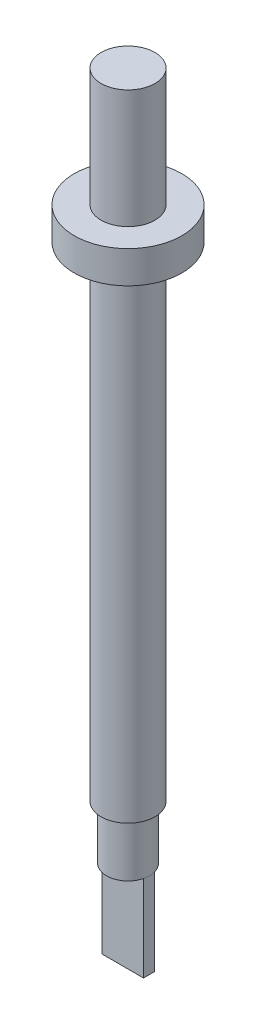
ISO-10303-21;
HEADER;
FILE_DESCRIPTION(('STEP AP214'),'2;1');
FILE_NAME('part.step','',(''),(''),'','','');
FILE_SCHEMA(('AUTOMOTIVE_DESIGN { 1 0 10303 214 1 1 1 1 }'));
ENDSEC;
DATA;
#1=APPLICATION_CONTEXT('core data for automotive mechanical design processes');
#2=APPLICATION_PROTOCOL_DEFINITION('international standard','automotive_design',2000,#1);
#3=PRODUCT_CONTEXT('',#1,'mechanical');
#4=PRODUCT('Part','Part','',(#3));
#5=PRODUCT_RELATED_PRODUCT_CATEGORY('part','',(#4));
#6=PRODUCT_DEFINITION_FORMATION('','',#4);
#7=PRODUCT_DEFINITION_CONTEXT('part definition',#1,'design');
#8=PRODUCT_DEFINITION('design','',#6,#7);
#9=PRODUCT_DEFINITION_SHAPE('','',#8);
#10=(LENGTH_UNIT() NAMED_UNIT(*) SI_UNIT(.MILLI.,.METRE.));
#11=(NAMED_UNIT(*) PLANE_ANGLE_UNIT() SI_UNIT($,.RADIAN.));
#12=(NAMED_UNIT(*) SI_UNIT($,.STERADIAN.) SOLID_ANGLE_UNIT());
#13=UNCERTAINTY_MEASURE_WITH_UNIT(LENGTH_MEASURE(1.E-05),#10,'distance_accuracy_value','');
#14=(GEOMETRIC_REPRESENTATION_CONTEXT(3) GLOBAL_UNCERTAINTY_ASSIGNED_CONTEXT((#13)) GLOBAL_UNIT_ASSIGNED_CONTEXT((#10,
#11,#12)) REPRESENTATION_CONTEXT('',''));
#15=CARTESIAN_POINT('',(0.,0.,0.));
#16=DIRECTION('',(0.,0.,1.));
#17=DIRECTION('',(1.,0.,0.));
#18=AXIS2_PLACEMENT_3D('',#15,#16,#17);
#19=CARTESIAN_POINT('',(0.,0.,0.));
#20=DIRECTION('',(0.,-1.,0.));
#21=DIRECTION('',(0.,0.,-1.));
#22=AXIS2_PLACEMENT_3D('',#19,#20,#21);
#23=PLANE('',#22);
#24=DIRECTION('',(0.,0.,-1.));
#25=VECTOR('',#24,1.);
#26=CARTESIAN_POINT('',(-1.93649167310371,0.,0.5));
#27=LINE('',#26,#25);
#28=CARTESIAN_POINT('',(-1.93649167310371,0.,0.5));
#29=VERTEX_POINT('',#28);
#30=CARTESIAN_POINT('',(-1.93649167310371,0.,-0.5));
#31=VERTEX_POINT('',#30);
#32=EDGE_CURVE('E62',#29,#31,#27,.T.);
#33=ORIENTED_EDGE('',*,*,#32,.F.);
#34=CARTESIAN_POINT('',(0.,0.,0.));
#35=DIRECTION('',(0.,-1.,0.));
#36=DIRECTION('',(0.,0.,-1.));
#37=AXIS2_PLACEMENT_3D('',#34,#35,#36);
#38=CIRCLE('',#37,2.);
#39=EDGE_CURVE('E127',#29,#31,#38,.T.);
#40=ORIENTED_EDGE('',*,*,#39,.T.);
#41=EDGE_LOOP('',(#33,#40));
#42=FACE_BOUND('',#41,.T.);
#43=ADVANCED_FACE('F39',(#42),#23,.T.);
#44=DIRECTION('',(-1.,0.,0.));
#45=VECTOR('',#44,1.);
#46=CARTESIAN_POINT('',(-1.93649167310371,0.,0.5));
#47=LINE('',#46,#45);
#48=CARTESIAN_POINT('',(1.93649167310371,0.,0.499999999999999));
#49=VERTEX_POINT('',#48);
#50=EDGE_CURVE('E105',#49,#29,#47,.T.);
#51=ORIENTED_EDGE('',*,*,#50,.F.);
#52=EDGE_CURVE('E126',#49,#29,#38,.T.);
#53=ORIENTED_EDGE('',*,*,#52,.T.);
#54=EDGE_LOOP('',(#51,#53));
#55=FACE_BOUND('',#54,.T.);
#56=ADVANCED_FACE('F138',(#55),#23,.T.);
#57=DIRECTION('',(0.,0.,1.));
#58=VECTOR('',#57,1.);
#59=CARTESIAN_POINT('',(1.93649167310371,0.,0.5));
#60=LINE('',#59,#58);
#61=CARTESIAN_POINT('',(1.93649167310371,0.,-0.5));
#62=VERTEX_POINT('',#61);
#63=EDGE_CURVE('E141',#62,#49,#60,.T.);
#64=ORIENTED_EDGE('',*,*,#63,.F.);
#65=EDGE_CURVE('E43',#62,#49,#38,.T.);
#66=ORIENTED_EDGE('',*,*,#65,.T.);
#67=EDGE_LOOP('',(#64,#66));
#68=FACE_BOUND('',#67,.T.);
#69=ADVANCED_FACE('F199',(#68),#23,.T.);
#70=DIRECTION('',(1.,0.,0.));
#71=VECTOR('',#70,1.);
#72=CARTESIAN_POINT('',(-1.93649167310371,0.,-0.5));
#73=LINE('',#72,#71);
#74=EDGE_CURVE('E53',#31,#62,#73,.T.);
#75=ORIENTED_EDGE('',*,*,#74,.F.);
#76=EDGE_CURVE('E122',#31,#62,#38,.T.);
#77=ORIENTED_EDGE('',*,*,#76,.T.);
#78=EDGE_LOOP('',(#75,#77));
#79=FACE_BOUND('',#78,.T.);
#80=ADVANCED_FACE('F41',(#79),#23,.T.);
#81=CARTESIAN_POINT('',(0.,0.,0.));
#82=DIRECTION('',(0.,-1.,0.));
#83=DIRECTION('',(0.,0.,-1.));
#84=AXIS2_PLACEMENT_3D('',#81,#82,#83);
#85=CYLINDRICAL_SURFACE('',#84,2.);
#86=CARTESIAN_POINT('',(0.,5.,0.));
#87=DIRECTION('',(0.,-1.,0.));
#88=DIRECTION('',(0.,0.,-1.));
#89=AXIS2_PLACEMENT_3D('',#86,#87,#88);
#90=CIRCLE('',#89,2.);
#91=CARTESIAN_POINT('',(0.,5.,-2.));
#92=VERTEX_POINT('',#91);
#93=EDGE_CURVE('E123',#92,#92,#90,.T.);
#94=ORIENTED_EDGE('',*,*,#93,.T.);
#95=EDGE_LOOP('',(#94));
#96=FACE_BOUND('',#95,.T.);
#97=ORIENTED_EDGE('',*,*,#65,.F.);
#98=ORIENTED_EDGE('',*,*,#76,.F.);
#99=ORIENTED_EDGE('',*,*,#39,.F.);
#100=ORIENTED_EDGE('',*,*,#52,.F.);
#101=EDGE_LOOP('',(#97,#98,#99,#100));
#102=FACE_BOUND('',#101,.T.);
#103=ADVANCED_FACE('F193',(#96,#102),#85,.T.);
#104=CARTESIAN_POINT('',(2.,5.,0.));
#105=DIRECTION('',(0.,-1.,0.));
#106=DIRECTION('',(0.,0.,-1.));
#107=AXIS2_PLACEMENT_3D('',#104,#105,#106);
#108=PLANE('',#107);
#109=CARTESIAN_POINT('',(0.,5.,0.));
#110=DIRECTION('',(0.,-1.,0.));
#111=DIRECTION('',(0.,0.,-1.));
#112=AXIS2_PLACEMENT_3D('',#109,#110,#111);
#113=CIRCLE('',#112,2.5);
#114=CARTESIAN_POINT('',(0.,5.,-2.5));
#115=VERTEX_POINT('',#114);
#116=EDGE_CURVE('E116',#115,#115,#113,.T.);
#117=ORIENTED_EDGE('',*,*,#116,.T.);
#118=EDGE_LOOP('',(#117));
#119=FACE_BOUND('',#118,.T.);
#120=ORIENTED_EDGE('',*,*,#93,.F.);
#121=EDGE_LOOP('',(#120));
#122=FACE_BOUND('',#121,.T.);
#123=ADVANCED_FACE('F183',(#119,#122),#108,.T.);
#124=CARTESIAN_POINT('',(0.,0.,0.));
#125=DIRECTION('',(0.,-1.,0.));
#126=DIRECTION('',(0.,0.,-1.));
#127=AXIS2_PLACEMENT_3D('',#124,#125,#126);
#128=CYLINDRICAL_SURFACE('',#127,2.5);
#129=CARTESIAN_POINT('',(0.,50.,0.));
#130=DIRECTION('',(0.,-1.,0.));
#131=DIRECTION('',(0.,0.,-1.));
#132=AXIS2_PLACEMENT_3D('',#129,#130,#131);
#133=CIRCLE('',#132,2.5);
#134=CARTESIAN_POINT('',(0.,50.,-2.5));
#135=VERTEX_POINT('',#134);
#136=EDGE_CURVE('E117',#135,#135,#133,.T.);
#137=ORIENTED_EDGE('',*,*,#136,.T.);
#138=EDGE_LOOP('',(#137));
#139=FACE_BOUND('',#138,.T.);
#140=ORIENTED_EDGE('',*,*,#116,.F.);
#141=EDGE_LOOP('',(#140));
#142=FACE_BOUND('',#141,.T.);
#143=ADVANCED_FACE('F180',(#139,#142),#128,.T.);
#144=CARTESIAN_POINT('',(5.,50.,0.));
#145=DIRECTION('',(0.,-1.,0.));
#146=DIRECTION('',(0.,0.,-1.));
#147=AXIS2_PLACEMENT_3D('',#144,#145,#146);
#148=PLANE('',#147);
#149=CARTESIAN_POINT('',(0.,50.,0.));
#150=DIRECTION('',(0.,-1.,0.));
#151=DIRECTION('',(0.,0.,-1.));
#152=AXIS2_PLACEMENT_3D('',#149,#150,#151);
#153=CIRCLE('',#152,5.);
#154=CARTESIAN_POINT('',(0.,50.,-5.));
#155=VERTEX_POINT('',#154);
#156=EDGE_CURVE('E107',#155,#155,#153,.T.);
#157=ORIENTED_EDGE('',*,*,#156,.T.);
#158=EDGE_LOOP('',(#157));
#159=FACE_BOUND('',#158,.T.);
#160=ORIENTED_EDGE('',*,*,#136,.F.);
#161=EDGE_LOOP('',(#160));
#162=FACE_BOUND('',#161,.T.);
#163=ADVANCED_FACE('F174',(#159,#162),#148,.T.);
#164=CARTESIAN_POINT('',(0.,0.,0.));
#165=DIRECTION('',(0.,-1.,0.));
#166=DIRECTION('',(0.,0.,-1.));
#167=AXIS2_PLACEMENT_3D('',#164,#165,#166);
#168=CYLINDRICAL_SURFACE('',#167,5.);
#169=CARTESIAN_POINT('',(0.,53.,0.));
#170=DIRECTION('',(0.,-1.,0.));
#171=DIRECTION('',(0.,0.,-1.));
#172=AXIS2_PLACEMENT_3D('',#169,#170,#171);
#173=CIRCLE('',#172,5.);
#174=CARTESIAN_POINT('',(0.,53.,-5.));
#175=VERTEX_POINT('',#174);
#176=EDGE_CURVE('E104',#175,#175,#173,.T.);
#177=ORIENTED_EDGE('',*,*,#176,.T.);
#178=EDGE_LOOP('',(#177));
#179=FACE_BOUND('',#178,.T.);
#180=ORIENTED_EDGE('',*,*,#156,.F.);
#181=EDGE_LOOP('',(#180));
#182=FACE_BOUND('',#181,.T.);
#183=ADVANCED_FACE('F170',(#179,#182),#168,.T.);
#184=CARTESIAN_POINT('',(0.,53.,0.));
#185=DIRECTION('',(0.,1.,0.));
#186=DIRECTION('',(0.,0.,1.));
#187=AXIS2_PLACEMENT_3D('',#184,#185,#186);
#188=PLANE('',#187);
#189=CARTESIAN_POINT('',(0.,53.,0.));
#190=DIRECTION('',(0.,1.,0.));
#191=DIRECTION('',(0.,0.,1.));
#192=AXIS2_PLACEMENT_3D('',#189,#190,#191);
#193=CIRCLE('',#192,2.5);
#194=CARTESIAN_POINT('',(0.,53.,2.5));
#195=VERTEX_POINT('',#194);
#196=EDGE_CURVE('E11',#195,#195,#193,.T.);
#197=ORIENTED_EDGE('',*,*,#196,.F.);
#198=EDGE_LOOP('',(#197));
#199=FACE_BOUND('',#198,.T.);
#200=ORIENTED_EDGE('',*,*,#176,.F.);
#201=EDGE_LOOP('',(#200));
#202=FACE_BOUND('',#201,.T.);
#203=ADVANCED_FACE('F163',(#199,#202),#188,.T.);
#204=CARTESIAN_POINT('',(-1.93649167310371,-8.,0.5));
#205=DIRECTION('',(1.,0.,0.));
#206=DIRECTION('',(0.,0.,-1.));
#207=AXIS2_PLACEMENT_3D('',#204,#205,#206);
#208=PLANE('',#207);
#209=ORIENTED_EDGE('',*,*,#32,.T.);
#210=DIRECTION('',(0.,1.,0.));
#211=VECTOR('',#210,1.);
#212=CARTESIAN_POINT('',(-1.93649167310371,-8.,-0.5));
#213=LINE('',#212,#211);
#214=CARTESIAN_POINT('',(-1.93649167310371,-8.,-0.5));
#215=VERTEX_POINT('',#214);
#216=EDGE_CURVE('E87',#215,#31,#213,.T.);
#217=ORIENTED_EDGE('',*,*,#216,.F.);
#218=DIRECTION('',(0.,0.,-1.));
#219=VECTOR('',#218,1.);
#220=CARTESIAN_POINT('',(-1.93649167310371,-8.,0.5));
#221=LINE('',#220,#219);
#222=CARTESIAN_POINT('',(-1.93649167310371,-8.,0.5));
#223=VERTEX_POINT('',#222);
#224=EDGE_CURVE('E91',#223,#215,#221,.T.);
#225=ORIENTED_EDGE('',*,*,#224,.F.);
#226=DIRECTION('',(0.,1.,0.));
#227=VECTOR('',#226,1.);
#228=CARTESIAN_POINT('',(-1.93649167310371,-8.,0.5));
#229=LINE('',#228,#227);
#230=EDGE_CURVE('E143',#223,#29,#229,.T.);
#231=ORIENTED_EDGE('',*,*,#230,.T.);
#232=EDGE_LOOP('',(#209,#217,#225,#231));
#233=FACE_BOUND('',#232,.T.);
#234=ADVANCED_FACE('F102',(#233),#208,.F.);
#235=CARTESIAN_POINT('',(-1.93649167310371,-8.,-0.5));
#236=DIRECTION('',(0.,0.,1.));
#237=DIRECTION('',(1.,0.,0.));
#238=AXIS2_PLACEMENT_3D('',#235,#236,#237);
#239=PLANE('',#238);
#240=ORIENTED_EDGE('',*,*,#74,.T.);
#241=DIRECTION('',(0.,1.,0.));
#242=VECTOR('',#241,1.);
#243=CARTESIAN_POINT('',(1.93649167310371,-8.,-0.5));
#244=LINE('',#243,#242);
#245=CARTESIAN_POINT('',(1.93649167310371,-8.,-0.5));
#246=VERTEX_POINT('',#245);
#247=EDGE_CURVE('E90',#246,#62,#244,.T.);
#248=ORIENTED_EDGE('',*,*,#247,.F.);
#249=DIRECTION('',(1.,0.,0.));
#250=VECTOR('',#249,1.);
#251=CARTESIAN_POINT('',(-1.93649167310371,-8.,-0.5));
#252=LINE('',#251,#250);
#253=EDGE_CURVE('E82',#215,#246,#252,.T.);
#254=ORIENTED_EDGE('',*,*,#253,.F.);
#255=ORIENTED_EDGE('',*,*,#216,.T.);
#256=EDGE_LOOP('',(#240,#248,#254,#255));
#257=FACE_BOUND('',#256,.T.);
#258=ADVANCED_FACE('F81',(#257),#239,.F.);
#259=CARTESIAN_POINT('',(1.93649167310371,-8.,0.5));
#260=DIRECTION('',(-1.,0.,0.));
#261=DIRECTION('',(0.,0.,1.));
#262=AXIS2_PLACEMENT_3D('',#259,#260,#261);
#263=PLANE('',#262);
#264=ORIENTED_EDGE('',*,*,#63,.T.);
#265=DIRECTION('',(0.,1.,0.));
#266=VECTOR('',#265,1.);
#267=CARTESIAN_POINT('',(1.93649167310371,-8.,0.5));
#268=LINE('',#267,#266);
#269=CARTESIAN_POINT('',(1.93649167310371,-8.,0.5));
#270=VERTEX_POINT('',#269);
#271=EDGE_CURVE('E109',#270,#49,#268,.T.);
#272=ORIENTED_EDGE('',*,*,#271,.F.);
#273=DIRECTION('',(0.,0.,1.));
#274=VECTOR('',#273,1.);
#275=CARTESIAN_POINT('',(1.93649167310371,-8.,0.5));
#276=LINE('',#275,#274);
#277=EDGE_CURVE('E95',#246,#270,#276,.T.);
#278=ORIENTED_EDGE('',*,*,#277,.F.);
#279=ORIENTED_EDGE('',*,*,#247,.T.);
#280=EDGE_LOOP('',(#264,#272,#278,#279));
#281=FACE_BOUND('',#280,.T.);
#282=ADVANCED_FACE('F208',(#281),#263,.F.);
#283=CARTESIAN_POINT('',(-1.93649167310371,-8.,0.5));
#284=DIRECTION('',(0.,0.,-1.));
#285=DIRECTION('',(-1.,0.,0.));
#286=AXIS2_PLACEMENT_3D('',#283,#284,#285);
#287=PLANE('',#286);
#288=ORIENTED_EDGE('',*,*,#50,.T.);
#289=ORIENTED_EDGE('',*,*,#230,.F.);
#290=DIRECTION('',(-1.,0.,0.));
#291=VECTOR('',#290,1.);
#292=CARTESIAN_POINT('',(-1.93649167310371,-8.,0.5));
#293=LINE('',#292,#291);
#294=EDGE_CURVE('E98',#270,#223,#293,.T.);
#295=ORIENTED_EDGE('',*,*,#294,.F.);
#296=ORIENTED_EDGE('',*,*,#271,.T.);
#297=EDGE_LOOP('',(#288,#289,#295,#296));
#298=FACE_BOUND('',#297,.T.);
#299=ADVANCED_FACE('F136',(#298),#287,.F.);
#300=CARTESIAN_POINT('',(0.,-8.,0.));
#301=DIRECTION('',(0.,-1.,0.));
#302=DIRECTION('',(0.,0.,-1.));
#303=AXIS2_PLACEMENT_3D('',#300,#301,#302);
#304=PLANE('',#303);
#305=ORIENTED_EDGE('',*,*,#224,.T.);
#306=ORIENTED_EDGE('',*,*,#253,.T.);
#307=ORIENTED_EDGE('',*,*,#277,.T.);
#308=ORIENTED_EDGE('',*,*,#294,.T.);
#309=EDGE_LOOP('',(#305,#306,#307,#308));
#310=FACE_BOUND('',#309,.T.);
#311=ADVANCED_FACE('F96',(#310),#304,.T.);
#312=CARTESIAN_POINT('',(0.,64.,0.));
#313=DIRECTION('',(0.,-1.,0.));
#314=DIRECTION('',(0.,0.,-1.));
#315=AXIS2_PLACEMENT_3D('',#312,#313,#314);
#316=CYLINDRICAL_SURFACE('',#315,2.5);
#317=CARTESIAN_POINT('',(0.,64.,0.));
#318=DIRECTION('',(0.,1.,0.));
#319=DIRECTION('',(0.,0.,1.));
#320=AXIS2_PLACEMENT_3D('',#317,#318,#319);
#321=CIRCLE('',#320,2.5);
#322=CARTESIAN_POINT('',(0.,64.,2.5));
#323=VERTEX_POINT('',#322);
#324=EDGE_CURVE('E147',#323,#323,#321,.T.);
#325=ORIENTED_EDGE('',*,*,#324,.F.);
#326=EDGE_LOOP('',(#325));
#327=FACE_BOUND('',#326,.T.);
#328=ORIENTED_EDGE('',*,*,#196,.T.);
#329=EDGE_LOOP('',(#328));
#330=FACE_BOUND('',#329,.T.);
#331=ADVANCED_FACE('F158',(#327,#330),#316,.T.);
#332=CARTESIAN_POINT('',(0.,64.,0.));
#333=DIRECTION('',(0.,1.,0.));
#334=DIRECTION('',(0.,0.,1.));
#335=AXIS2_PLACEMENT_3D('',#332,#333,#334);
#336=PLANE('',#335);
#337=ORIENTED_EDGE('',*,*,#324,.T.);
#338=EDGE_LOOP('',(#337));
#339=FACE_BOUND('',#338,.T.);
#340=ADVANCED_FACE('F156',(#339),#336,.T.);
#341=CLOSED_SHELL('',(#43,#56,#69,#80,#103,#123,#143,#163,#183,#203,#234,#258,#282,#299,#311,
#331,#340));
#342=MANIFOLD_SOLID_BREP('B2',#341);
#343=ADVANCED_BREP_SHAPE_REPRESENTATION('',(#18,#342),#14);
#344=SHAPE_DEFINITION_REPRESENTATION(#9,#343);
ENDSEC;
END-ISO-10303-21;
